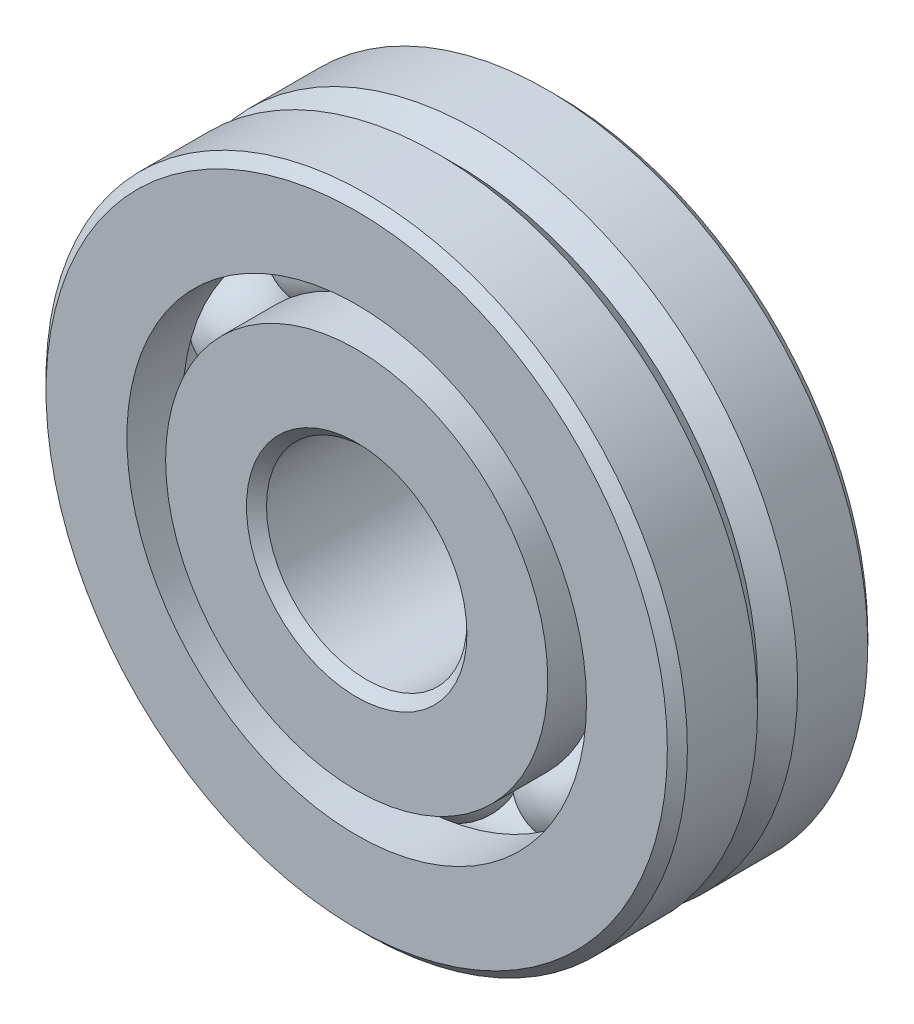
ISO-10303-21;
HEADER;
FILE_DESCRIPTION(('STEP AP214'),'2;1');
FILE_NAME('part.step','',(''),(''),'','','');
FILE_SCHEMA(('AUTOMOTIVE_DESIGN { 1 0 10303 214 1 1 1 1 }'));
ENDSEC;
DATA;
#1=APPLICATION_CONTEXT('core data for automotive mechanical design processes');
#2=APPLICATION_PROTOCOL_DEFINITION('international standard','automotive_design',2000,#1);
#3=PRODUCT_CONTEXT('',#1,'mechanical');
#4=PRODUCT('Part','Part','',(#3));
#5=PRODUCT_RELATED_PRODUCT_CATEGORY('part','',(#4));
#6=PRODUCT_DEFINITION_FORMATION('','',#4);
#7=PRODUCT_DEFINITION_CONTEXT('part definition',#1,'design');
#8=PRODUCT_DEFINITION('design','',#6,#7);
#9=PRODUCT_DEFINITION_SHAPE('','',#8);
#10=(LENGTH_UNIT() NAMED_UNIT(*) SI_UNIT(.MILLI.,.METRE.));
#11=(NAMED_UNIT(*) PLANE_ANGLE_UNIT() SI_UNIT($,.RADIAN.));
#12=(NAMED_UNIT(*) SI_UNIT($,.STERADIAN.) SOLID_ANGLE_UNIT());
#13=UNCERTAINTY_MEASURE_WITH_UNIT(LENGTH_MEASURE(1.E-05),#10,'distance_accuracy_value','');
#14=(GEOMETRIC_REPRESENTATION_CONTEXT(3) GLOBAL_UNCERTAINTY_ASSIGNED_CONTEXT((#13)) GLOBAL_UNIT_ASSIGNED_CONTEXT((#10,
#11,#12)) REPRESENTATION_CONTEXT('',''));
#15=CARTESIAN_POINT('',(0.,0.,0.));
#16=DIRECTION('',(0.,0.,1.));
#17=DIRECTION('',(1.,0.,0.));
#18=AXIS2_PLACEMENT_3D('',#15,#16,#17);
#19=CARTESIAN_POINT('',(-3.08587257453543,4.24733922046851,0.));
#20=DIRECTION('',(0.,0.,1.));
#21=DIRECTION('',(-0.587785252292462,0.809016994374955,0.));
#22=AXIS2_PLACEMENT_3D('',#19,#20,#21);
#23=SPHERICAL_SURFACE('',#22,1.21175743903915);
#24=CARTESIAN_POINT('',(-3.08587257453543,4.24733922046851,1.21175743903915));
#25=VERTEX_POINT('',#24);
#26=VERTEX_LOOP('',#25);
#27=FACE_BOUND('',#26,.T.);
#28=ADVANCED_FACE('F38',(#27),#23,.T.);
#29=CLOSED_SHELL('',(#28));
#30=MANIFOLD_SOLID_BREP('B2',#29);
#31=CARTESIAN_POINT('',(-4.99304671054954,1.62233922046853,0.));
#32=DIRECTION('',(0.,0.,1.));
#33=DIRECTION('',(-0.95105651629515,0.309016994374958,0.));
#34=AXIS2_PLACEMENT_3D('',#31,#32,#33);
#35=SPHERICAL_SURFACE('',#34,1.21175743903915);
#36=CARTESIAN_POINT('',(-4.99304671054954,1.62233922046853,1.21175743903915));
#37=VERTEX_POINT('',#36);
#38=VERTEX_LOOP('',#37);
#39=FACE_BOUND('',#38,.T.);
#40=ADVANCED_FACE('F59',(#39),#35,.T.);
#41=CLOSED_SHELL('',(#40));
#42=MANIFOLD_SOLID_BREP('B6',#41);
#43=CARTESIAN_POINT('',(-4.99304671054957,-1.62233922046843,0.));
#44=DIRECTION('',(0.,0.,1.));
#45=DIRECTION('',(-0.951056516295157,-0.309016994374938,0.));
#46=AXIS2_PLACEMENT_3D('',#43,#44,#45);
#47=SPHERICAL_SURFACE('',#46,1.21175743903915);
#48=CARTESIAN_POINT('',(-4.99304671054957,-1.62233922046843,1.21175743903915));
#49=VERTEX_POINT('',#48);
#50=VERTEX_LOOP('',#49);
#51=FACE_BOUND('',#50,.T.);
#52=ADVANCED_FACE('F80',(#51),#47,.T.);
#53=CLOSED_SHELL('',(#52));
#54=MANIFOLD_SOLID_BREP('B34',#53);
#55=CARTESIAN_POINT('',(-3.08587257453552,-4.24733922046845,0.));
#56=DIRECTION('',(0.,0.,1.));
#57=DIRECTION('',(-0.58778525229248,-0.809016994374942,0.));
#58=AXIS2_PLACEMENT_3D('',#55,#56,#57);
#59=SPHERICAL_SURFACE('',#58,1.21175743903915);
#60=CARTESIAN_POINT('',(-3.08587257453552,-4.24733922046845,1.21175743903915));
#61=VERTEX_POINT('',#60);
#62=VERTEX_LOOP('',#61);
#63=FACE_BOUND('',#62,.T.);
#64=ADVANCED_FACE('F101',(#63),#59,.T.);
#65=CLOSED_SHELL('',(#64));
#66=MANIFOLD_SOLID_BREP('B55',#65);
#67=CARTESIAN_POINT('',(0.,-5.25,0.));
#68=DIRECTION('',(0.,0.,1.));
#69=DIRECTION('',(0.,-1.,0.));
#70=AXIS2_PLACEMENT_3D('',#67,#68,#69);
#71=SPHERICAL_SURFACE('',#70,1.21175743903915);
#72=CARTESIAN_POINT('',(0.,-5.25,1.21175743903915));
#73=VERTEX_POINT('',#72);
#74=VERTEX_LOOP('',#73);
#75=FACE_BOUND('',#74,.T.);
#76=ADVANCED_FACE('F122',(#75),#71,.T.);
#77=CLOSED_SHELL('',(#76));
#78=MANIFOLD_SOLID_BREP('B76',#77);
#79=CARTESIAN_POINT('',(3.08587257453546,-4.24733922046849,0.));
#80=DIRECTION('',(0.,0.,1.));
#81=DIRECTION('',(0.587785252292469,-0.809016994374951,0.));
#82=AXIS2_PLACEMENT_3D('',#79,#80,#81);
#83=SPHERICAL_SURFACE('',#82,1.21175743903915);
#84=CARTESIAN_POINT('',(3.08587257453546,-4.24733922046849,1.21175743903915));
#85=VERTEX_POINT('',#84);
#86=VERTEX_LOOP('',#85);
#87=FACE_BOUND('',#86,.T.);
#88=ADVANCED_FACE('F143',(#87),#83,.T.);
#89=CLOSED_SHELL('',(#88));
#90=MANIFOLD_SOLID_BREP('B97',#89);
#91=CARTESIAN_POINT('',(4.99304671054955,-1.6223392204685,0.));
#92=DIRECTION('',(0.,0.,1.));
#93=DIRECTION('',(0.951056516295152,-0.309016994374952,0.));
#94=AXIS2_PLACEMENT_3D('',#91,#92,#93);
#95=SPHERICAL_SURFACE('',#94,1.21175743903915);
#96=CARTESIAN_POINT('',(4.99304671054955,-1.6223392204685,1.21175743903915));
#97=VERTEX_POINT('',#96);
#98=VERTEX_LOOP('',#97);
#99=FACE_BOUND('',#98,.T.);
#100=ADVANCED_FACE('F164',(#99),#95,.T.);
#101=CLOSED_SHELL('',(#100));
#102=MANIFOLD_SOLID_BREP('B118',#101);
#103=CARTESIAN_POINT('',(4.99304671054956,1.62233922046846,0.));
#104=DIRECTION('',(0.,0.,1.));
#105=DIRECTION('',(0.951056516295155,0.309016994374945,0.));
#106=AXIS2_PLACEMENT_3D('',#103,#104,#105);
#107=SPHERICAL_SURFACE('',#106,1.21175743903915);
#108=CARTESIAN_POINT('',(4.99304671054956,1.62233922046846,1.21175743903915));
#109=VERTEX_POINT('',#108);
#110=VERTEX_LOOP('',#109);
#111=FACE_BOUND('',#110,.T.);
#112=ADVANCED_FACE('F185',(#111),#107,.T.);
#113=CLOSED_SHELL('',(#112));
#114=MANIFOLD_SOLID_BREP('B139',#113);
#115=CARTESIAN_POINT('',(3.08587257453549,4.24733922046847,0.));
#116=DIRECTION('',(0.,0.,1.));
#117=DIRECTION('',(0.587785252292474,0.809016994374947,0.));
#118=AXIS2_PLACEMENT_3D('',#115,#116,#117);
#119=SPHERICAL_SURFACE('',#118,1.21175743903915);
#120=CARTESIAN_POINT('',(3.08587257453549,4.24733922046847,1.21175743903915));
#121=VERTEX_POINT('',#120);
#122=VERTEX_LOOP('',#121);
#123=FACE_BOUND('',#122,.T.);
#124=ADVANCED_FACE('F206',(#123),#119,.T.);
#125=CLOSED_SHELL('',(#124));
#126=MANIFOLD_SOLID_BREP('B160',#125);
#127=CARTESIAN_POINT('',(0.,5.25,0.));
#128=DIRECTION('',(0.,0.,1.));
#129=DIRECTION('',(0.,1.,0.));
#130=AXIS2_PLACEMENT_3D('',#127,#128,#129);
#131=SPHERICAL_SURFACE('',#130,1.21175743903915);
#132=CARTESIAN_POINT('',(0.,5.25,1.21175743903915));
#133=VERTEX_POINT('',#132);
#134=VERTEX_LOOP('',#133);
#135=FACE_BOUND('',#134,.T.);
#136=ADVANCED_FACE('F229',(#135),#131,.T.);
#137=CLOSED_SHELL('',(#136));
#138=MANIFOLD_SOLID_BREP('B181',#137);
#139=CARTESIAN_POINT('',(0.,4.76648351648352,2.5));
#140=DIRECTION('',(0.,0.,-1.));
#141=DIRECTION('',(-1.,0.,0.));
#142=AXIS2_PLACEMENT_3D('',#139,#140,#141);
#143=PLANE('',#142);
#144=CARTESIAN_POINT('',(0.,0.,2.5));
#145=DIRECTION('',(0.,0.,1.));
#146=DIRECTION('',(1.,0.,0.));
#147=AXIS2_PLACEMENT_3D('',#144,#145,#146);
#148=CIRCLE('',#147,2.75);
#149=CARTESIAN_POINT('',(2.75,0.,2.5));
#150=VERTEX_POINT('',#149);
#151=EDGE_CURVE('E277',#150,#150,#148,.T.);
#152=ORIENTED_EDGE('',*,*,#151,.F.);
#153=EDGE_LOOP('',(#152));
#154=FACE_BOUND('',#153,.T.);
#155=CARTESIAN_POINT('',(0.,0.,2.5));
#156=DIRECTION('',(0.,0.,1.));
#157=DIRECTION('',(1.,0.,0.));
#158=AXIS2_PLACEMENT_3D('',#155,#156,#157);
#159=CIRCLE('',#158,4.76648351648352);
#160=CARTESIAN_POINT('',(4.76648351648352,0.,2.5));
#161=VERTEX_POINT('',#160);
#162=EDGE_CURVE('E228',#161,#161,#159,.T.);
#163=ORIENTED_EDGE('',*,*,#162,.T.);
#164=EDGE_LOOP('',(#163));
#165=FACE_BOUND('',#164,.T.);
#166=ADVANCED_FACE('F249',(#154,#165),#143,.F.);
#167=CARTESIAN_POINT('',(0.,0.,2.5));
#168=DIRECTION('',(0.,0.,1.));
#169=DIRECTION('',(1.,0.,0.));
#170=AXIS2_PLACEMENT_3D('',#167,#168,#169);
#171=CYLINDRICAL_SURFACE('',#170,4.76648351648352);
#172=ORIENTED_EDGE('',*,*,#162,.F.);
#173=EDGE_LOOP('',(#172));
#174=FACE_BOUND('',#173,.T.);
#175=CARTESIAN_POINT('',(0.,0.,1.11111111111111));
#176=DIRECTION('',(0.,0.,1.));
#177=DIRECTION('',(1.,0.,0.));
#178=AXIS2_PLACEMENT_3D('',#175,#176,#177);
#179=CIRCLE('',#178,4.76648351648352);
#180=CARTESIAN_POINT('',(4.76648351648352,0.,1.11111111111111));
#181=VERTEX_POINT('',#180);
#182=EDGE_CURVE('E255',#181,#181,#179,.T.);
#183=ORIENTED_EDGE('',*,*,#182,.T.);
#184=EDGE_LOOP('',(#183));
#185=FACE_BOUND('',#184,.T.);
#186=ADVANCED_FACE('F284',(#174,#185),#171,.T.);
#187=CARTESIAN_POINT('',(0.,0.,0.));
#188=DIRECTION('',(0.,0.,1.));
#189=DIRECTION('',(1.,0.,0.));
#190=AXIS2_PLACEMENT_3D('',#187,#188,#189);
#191=TOROIDAL_SURFACE('',#190,5.25,1.21175743903915);
#192=ORIENTED_EDGE('',*,*,#182,.F.);
#193=EDGE_LOOP('',(#192));
#194=FACE_BOUND('',#193,.T.);
#195=CARTESIAN_POINT('',(0.,0.,-1.11111111111111));
#196=DIRECTION('',(0.,0.,1.));
#197=DIRECTION('',(1.,0.,0.));
#198=AXIS2_PLACEMENT_3D('',#195,#196,#197);
#199=CIRCLE('',#198,4.76648351648352);
#200=CARTESIAN_POINT('',(4.76648351648352,0.,-1.11111111111111));
#201=VERTEX_POINT('',#200);
#202=EDGE_CURVE('E259',#201,#201,#199,.T.);
#203=ORIENTED_EDGE('',*,*,#202,.T.);
#204=EDGE_LOOP('',(#203));
#205=FACE_BOUND('',#204,.T.);
#206=ADVANCED_FACE('F288',(#194,#205),#191,.F.);
#207=CARTESIAN_POINT('',(0.,0.,2.5));
#208=DIRECTION('',(0.,0.,1.));
#209=DIRECTION('',(1.,0.,0.));
#210=AXIS2_PLACEMENT_3D('',#207,#208,#209);
#211=CYLINDRICAL_SURFACE('',#210,4.76648351648352);
#212=ORIENTED_EDGE('',*,*,#202,.F.);
#213=EDGE_LOOP('',(#212));
#214=FACE_BOUND('',#213,.T.);
#215=CARTESIAN_POINT('',(0.,0.,-2.5));
#216=DIRECTION('',(0.,0.,1.));
#217=DIRECTION('',(1.,0.,0.));
#218=AXIS2_PLACEMENT_3D('',#215,#216,#217);
#219=CIRCLE('',#218,4.76648351648352);
#220=CARTESIAN_POINT('',(4.76648351648352,0.,-2.5));
#221=VERTEX_POINT('',#220);
#222=EDGE_CURVE('E263',#221,#221,#219,.T.);
#223=ORIENTED_EDGE('',*,*,#222,.T.);
#224=EDGE_LOOP('',(#223));
#225=FACE_BOUND('',#224,.T.);
#226=ADVANCED_FACE('F293',(#214,#225),#211,.T.);
#227=CARTESIAN_POINT('',(0.,2.75,-2.5));
#228=DIRECTION('',(0.,0.,1.));
#229=DIRECTION('',(1.,0.,0.));
#230=AXIS2_PLACEMENT_3D('',#227,#228,#229);
#231=PLANE('',#230);
#232=ORIENTED_EDGE('',*,*,#222,.F.);
#233=EDGE_LOOP('',(#232));
#234=FACE_BOUND('',#233,.T.);
#235=CARTESIAN_POINT('',(0.,0.,-2.5));
#236=DIRECTION('',(0.,0.,1.));
#237=DIRECTION('',(1.,0.,0.));
#238=AXIS2_PLACEMENT_3D('',#235,#236,#237);
#239=CIRCLE('',#238,2.75);
#240=CARTESIAN_POINT('',(2.75,0.,-2.5));
#241=VERTEX_POINT('',#240);
#242=EDGE_CURVE('E268',#241,#241,#239,.T.);
#243=ORIENTED_EDGE('',*,*,#242,.T.);
#244=EDGE_LOOP('',(#243));
#245=FACE_BOUND('',#244,.T.);
#246=ADVANCED_FACE('F299',(#234,#245),#231,.F.);
#247=CARTESIAN_POINT('',(0.,0.,-2.25));
#248=DIRECTION('',(0.,0.,-1.));
#249=DIRECTION('',(-1.,0.,0.));
#250=AXIS2_PLACEMENT_3D('',#247,#248,#249);
#251=CONICAL_SURFACE('',#250,2.5,0.785398163397444);
#252=ORIENTED_EDGE('',*,*,#242,.F.);
#253=EDGE_LOOP('',(#252));
#254=FACE_BOUND('',#253,.T.);
#255=CARTESIAN_POINT('',(0.,0.,-2.25));
#256=DIRECTION('',(0.,0.,1.));
#257=DIRECTION('',(1.,0.,0.));
#258=AXIS2_PLACEMENT_3D('',#255,#256,#257);
#259=CIRCLE('',#258,2.5);
#260=CARTESIAN_POINT('',(2.5,0.,-2.25));
#261=VERTEX_POINT('',#260);
#262=EDGE_CURVE('E271',#261,#261,#259,.T.);
#263=ORIENTED_EDGE('',*,*,#262,.T.);
#264=EDGE_LOOP('',(#263));
#265=FACE_BOUND('',#264,.T.);
#266=ADVANCED_FACE('F303',(#254,#265),#251,.F.);
#267=CARTESIAN_POINT('',(0.,0.,2.5));
#268=DIRECTION('',(0.,0.,1.));
#269=DIRECTION('',(1.,0.,0.));
#270=AXIS2_PLACEMENT_3D('',#267,#268,#269);
#271=CYLINDRICAL_SURFACE('',#270,2.5);
#272=ORIENTED_EDGE('',*,*,#262,.F.);
#273=EDGE_LOOP('',(#272));
#274=FACE_BOUND('',#273,.T.);
#275=CARTESIAN_POINT('',(0.,0.,2.25));
#276=DIRECTION('',(0.,0.,1.));
#277=DIRECTION('',(1.,0.,0.));
#278=AXIS2_PLACEMENT_3D('',#275,#276,#277);
#279=CIRCLE('',#278,2.5);
#280=CARTESIAN_POINT('',(2.5,0.,2.25));
#281=VERTEX_POINT('',#280);
#282=EDGE_CURVE('E274',#281,#281,#279,.T.);
#283=ORIENTED_EDGE('',*,*,#282,.T.);
#284=EDGE_LOOP('',(#283));
#285=FACE_BOUND('',#284,.T.);
#286=ADVANCED_FACE('F307',(#274,#285),#271,.F.);
#287=CARTESIAN_POINT('',(0.,0.,2.5));
#288=DIRECTION('',(0.,0.,1.));
#289=DIRECTION('',(1.,0.,0.));
#290=AXIS2_PLACEMENT_3D('',#287,#288,#289);
#291=CONICAL_SURFACE('',#290,2.75,0.785398163397453);
#292=ORIENTED_EDGE('',*,*,#282,.F.);
#293=EDGE_LOOP('',(#292));
#294=FACE_BOUND('',#293,.T.);
#295=ORIENTED_EDGE('',*,*,#151,.T.);
#296=EDGE_LOOP('',(#295));
#297=FACE_BOUND('',#296,.T.);
#298=ADVANCED_FACE('F281',(#294,#297),#291,.F.);
#299=CLOSED_SHELL('',(#166,#186,#206,#226,#246,#266,#286,#298));
#300=MANIFOLD_SOLID_BREP('B202',#299);
#301=CARTESIAN_POINT('',(0.,0.,2.5));
#302=DIRECTION('',(0.,0.,1.));
#303=DIRECTION('',(1.,0.,0.));
#304=AXIS2_PLACEMENT_3D('',#301,#302,#303);
#305=CYLINDRICAL_SURFACE('',#304,8.);
#306=CARTESIAN_POINT('',(0.,0.,2.25));
#307=DIRECTION('',(0.,0.,1.));
#308=DIRECTION('',(1.,0.,0.));
#309=AXIS2_PLACEMENT_3D('',#306,#307,#308);
#310=CIRCLE('',#309,8.);
#311=CARTESIAN_POINT('',(8.,0.,2.25));
#312=VERTEX_POINT('',#311);
#313=EDGE_CURVE('E408',#312,#312,#310,.T.);
#314=ORIENTED_EDGE('',*,*,#313,.F.);
#315=EDGE_LOOP('',(#314));
#316=FACE_BOUND('',#315,.T.);
#317=CARTESIAN_POINT('',(0.,0.,0.499999999999998));
#318=DIRECTION('',(0.,0.,1.));
#319=DIRECTION('',(1.,0.,0.));
#320=AXIS2_PLACEMENT_3D('',#317,#318,#319);
#321=CIRCLE('',#320,8.);
#322=CARTESIAN_POINT('',(8.,0.,0.499999999999998));
#323=VERTEX_POINT('',#322);
#324=EDGE_CURVE('E248',#323,#323,#321,.T.);
#325=ORIENTED_EDGE('',*,*,#324,.T.);
#326=EDGE_LOOP('',(#325));
#327=FACE_BOUND('',#326,.T.);
#328=ADVANCED_FACE('F371',(#316,#327),#305,.T.);
#329=CARTESIAN_POINT('',(0.,0.,0.));
#330=DIRECTION('',(0.,0.,1.));
#331=DIRECTION('',(1.,0.,0.));
#332=AXIS2_PLACEMENT_3D('',#329,#330,#331);
#333=CONICAL_SURFACE('',#332,7.5,0.78539816339745);
#334=ORIENTED_EDGE('',*,*,#324,.F.);
#335=EDGE_LOOP('',(#334));
#336=FACE_BOUND('',#335,.T.);
#337=CARTESIAN_POINT('',(0.,0.,0.));
#338=DIRECTION('',(0.,0.,1.));
#339=DIRECTION('',(1.,0.,0.));
#340=AXIS2_PLACEMENT_3D('',#337,#338,#339);
#341=CIRCLE('',#340,7.5);
#342=CARTESIAN_POINT('',(7.5,0.,0.));
#343=VERTEX_POINT('',#342);
#344=EDGE_CURVE('E377',#343,#343,#341,.T.);
#345=ORIENTED_EDGE('',*,*,#344,.T.);
#346=EDGE_LOOP('',(#345));
#347=FACE_BOUND('',#346,.T.);
#348=ADVANCED_FACE('F415',(#336,#347),#333,.T.);
#349=CARTESIAN_POINT('',(0.,0.,-0.500000000000002));
#350=DIRECTION('',(0.,0.,-1.));
#351=DIRECTION('',(-1.,0.,0.));
#352=AXIS2_PLACEMENT_3D('',#349,#350,#351);
#353=CONICAL_SURFACE('',#352,8.,0.785398163397447);
#354=ORIENTED_EDGE('',*,*,#344,.F.);
#355=EDGE_LOOP('',(#354));
#356=FACE_BOUND('',#355,.T.);
#357=CARTESIAN_POINT('',(0.,0.,-0.500000000000002));
#358=DIRECTION('',(0.,0.,1.));
#359=DIRECTION('',(1.,0.,0.));
#360=AXIS2_PLACEMENT_3D('',#357,#358,#359);
#361=CIRCLE('',#360,8.);
#362=CARTESIAN_POINT('',(8.,0.,-0.500000000000002));
#363=VERTEX_POINT('',#362);
#364=EDGE_CURVE('E381',#363,#363,#361,.T.);
#365=ORIENTED_EDGE('',*,*,#364,.T.);
#366=EDGE_LOOP('',(#365));
#367=FACE_BOUND('',#366,.T.);
#368=ADVANCED_FACE('F419',(#356,#367),#353,.T.);
#369=CARTESIAN_POINT('',(0.,0.,2.5));
#370=DIRECTION('',(0.,0.,1.));
#371=DIRECTION('',(1.,0.,0.));
#372=AXIS2_PLACEMENT_3D('',#369,#370,#371);
#373=CYLINDRICAL_SURFACE('',#372,8.);
#374=ORIENTED_EDGE('',*,*,#364,.F.);
#375=EDGE_LOOP('',(#374));
#376=FACE_BOUND('',#375,.T.);
#377=CARTESIAN_POINT('',(0.,0.,-2.25));
#378=DIRECTION('',(0.,0.,1.));
#379=DIRECTION('',(1.,0.,0.));
#380=AXIS2_PLACEMENT_3D('',#377,#378,#379);
#381=CIRCLE('',#380,8.);
#382=CARTESIAN_POINT('',(8.,0.,-2.25));
#383=VERTEX_POINT('',#382);
#384=EDGE_CURVE('E385',#383,#383,#381,.T.);
#385=ORIENTED_EDGE('',*,*,#384,.T.);
#386=EDGE_LOOP('',(#385));
#387=FACE_BOUND('',#386,.T.);
#388=ADVANCED_FACE('F424',(#376,#387),#373,.T.);
#389=CARTESIAN_POINT('',(0.,0.,-2.5));
#390=DIRECTION('',(0.,0.,1.));
#391=DIRECTION('',(1.,0.,0.));
#392=AXIS2_PLACEMENT_3D('',#389,#390,#391);
#393=CONICAL_SURFACE('',#392,7.75,0.785398163397443);
#394=ORIENTED_EDGE('',*,*,#384,.F.);
#395=EDGE_LOOP('',(#394));
#396=FACE_BOUND('',#395,.T.);
#397=CARTESIAN_POINT('',(0.,0.,-2.5));
#398=DIRECTION('',(0.,0.,1.));
#399=DIRECTION('',(1.,0.,0.));
#400=AXIS2_PLACEMENT_3D('',#397,#398,#399);
#401=CIRCLE('',#400,7.75);
#402=CARTESIAN_POINT('',(7.75,0.,-2.5));
#403=VERTEX_POINT('',#402);
#404=EDGE_CURVE('E390',#403,#403,#401,.T.);
#405=ORIENTED_EDGE('',*,*,#404,.T.);
#406=EDGE_LOOP('',(#405));
#407=FACE_BOUND('',#406,.T.);
#408=ADVANCED_FACE('F430',(#396,#407),#393,.T.);
#409=CARTESIAN_POINT('',(0.,7.75,-2.5));
#410=DIRECTION('',(0.,0.,1.));
#411=DIRECTION('',(1.,0.,0.));
#412=AXIS2_PLACEMENT_3D('',#409,#410,#411);
#413=PLANE('',#412);
#414=ORIENTED_EDGE('',*,*,#404,.F.);
#415=EDGE_LOOP('',(#414));
#416=FACE_BOUND('',#415,.T.);
#417=CARTESIAN_POINT('',(0.,0.,-2.5));
#418=DIRECTION('',(0.,0.,1.));
#419=DIRECTION('',(1.,0.,0.));
#420=AXIS2_PLACEMENT_3D('',#417,#418,#419);
#421=CIRCLE('',#420,5.73351648351648);
#422=CARTESIAN_POINT('',(5.73351648351648,0.,-2.5));
#423=VERTEX_POINT('',#422);
#424=EDGE_CURVE('E393',#423,#423,#421,.T.);
#425=ORIENTED_EDGE('',*,*,#424,.T.);
#426=EDGE_LOOP('',(#425));
#427=FACE_BOUND('',#426,.T.);
#428=ADVANCED_FACE('F434',(#416,#427),#413,.F.);
#429=CARTESIAN_POINT('',(0.,0.,2.5));
#430=DIRECTION('',(0.,0.,1.));
#431=DIRECTION('',(1.,0.,0.));
#432=AXIS2_PLACEMENT_3D('',#429,#430,#431);
#433=CYLINDRICAL_SURFACE('',#432,5.73351648351648);
#434=ORIENTED_EDGE('',*,*,#424,.F.);
#435=EDGE_LOOP('',(#434));
#436=FACE_BOUND('',#435,.T.);
#437=CARTESIAN_POINT('',(0.,0.,-1.11111111111111));
#438=DIRECTION('',(0.,0.,1.));
#439=DIRECTION('',(1.,0.,0.));
#440=AXIS2_PLACEMENT_3D('',#437,#438,#439);
#441=CIRCLE('',#440,5.73351648351648);
#442=CARTESIAN_POINT('',(5.73351648351648,0.,-1.11111111111111));
#443=VERTEX_POINT('',#442);
#444=EDGE_CURVE('E396',#443,#443,#441,.T.);
#445=ORIENTED_EDGE('',*,*,#444,.T.);
#446=EDGE_LOOP('',(#445));
#447=FACE_BOUND('',#446,.T.);
#448=ADVANCED_FACE('F438',(#436,#447),#433,.F.);
#449=CARTESIAN_POINT('',(0.,0.,0.));
#450=DIRECTION('',(0.,0.,1.));
#451=DIRECTION('',(1.,0.,0.));
#452=AXIS2_PLACEMENT_3D('',#449,#450,#451);
#453=TOROIDAL_SURFACE('',#452,5.25,1.21175743903915);
#454=ORIENTED_EDGE('',*,*,#444,.F.);
#455=EDGE_LOOP('',(#454));
#456=FACE_BOUND('',#455,.T.);
#457=CARTESIAN_POINT('',(0.,0.,1.11111111111111));
#458=DIRECTION('',(0.,0.,1.));
#459=DIRECTION('',(1.,0.,0.));
#460=AXIS2_PLACEMENT_3D('',#457,#458,#459);
#461=CIRCLE('',#460,5.73351648351648);
#462=CARTESIAN_POINT('',(5.73351648351648,0.,1.11111111111111));
#463=VERTEX_POINT('',#462);
#464=EDGE_CURVE('E399',#463,#463,#461,.T.);
#465=ORIENTED_EDGE('',*,*,#464,.T.);
#466=EDGE_LOOP('',(#465));
#467=FACE_BOUND('',#466,.T.);
#468=ADVANCED_FACE('F442',(#456,#467),#453,.F.);
#469=CARTESIAN_POINT('',(0.,0.,2.5));
#470=DIRECTION('',(0.,0.,1.));
#471=DIRECTION('',(1.,0.,0.));
#472=AXIS2_PLACEMENT_3D('',#469,#470,#471);
#473=CYLINDRICAL_SURFACE('',#472,5.73351648351648);
#474=ORIENTED_EDGE('',*,*,#464,.F.);
#475=EDGE_LOOP('',(#474));
#476=FACE_BOUND('',#475,.T.);
#477=CARTESIAN_POINT('',(0.,0.,2.5));
#478=DIRECTION('',(0.,0.,1.));
#479=DIRECTION('',(1.,0.,0.));
#480=AXIS2_PLACEMENT_3D('',#477,#478,#479);
#481=CIRCLE('',#480,5.73351648351648);
#482=CARTESIAN_POINT('',(5.73351648351648,0.,2.5));
#483=VERTEX_POINT('',#482);
#484=EDGE_CURVE('E402',#483,#483,#481,.T.);
#485=ORIENTED_EDGE('',*,*,#484,.T.);
#486=EDGE_LOOP('',(#485));
#487=FACE_BOUND('',#486,.T.);
#488=ADVANCED_FACE('F446',(#476,#487),#473,.F.);
#489=CARTESIAN_POINT('',(0.,7.75,2.5));
#490=DIRECTION('',(0.,0.,-1.));
#491=DIRECTION('',(-1.,0.,0.));
#492=AXIS2_PLACEMENT_3D('',#489,#490,#491);
#493=PLANE('',#492);
#494=ORIENTED_EDGE('',*,*,#484,.F.);
#495=EDGE_LOOP('',(#494));
#496=FACE_BOUND('',#495,.T.);
#497=CARTESIAN_POINT('',(0.,0.,2.5));
#498=DIRECTION('',(0.,0.,1.));
#499=DIRECTION('',(1.,0.,0.));
#500=AXIS2_PLACEMENT_3D('',#497,#498,#499);
#501=CIRCLE('',#500,7.75);
#502=CARTESIAN_POINT('',(7.75,0.,2.5));
#503=VERTEX_POINT('',#502);
#504=EDGE_CURVE('E405',#503,#503,#501,.T.);
#505=ORIENTED_EDGE('',*,*,#504,.T.);
#506=EDGE_LOOP('',(#505));
#507=FACE_BOUND('',#506,.T.);
#508=ADVANCED_FACE('F450',(#496,#507),#493,.F.);
#509=CARTESIAN_POINT('',(0.,0.,2.25));
#510=DIRECTION('',(0.,0.,-1.));
#511=DIRECTION('',(-1.,0.,0.));
#512=AXIS2_PLACEMENT_3D('',#509,#510,#511);
#513=CONICAL_SURFACE('',#512,8.,0.785398163397447);
#514=ORIENTED_EDGE('',*,*,#504,.F.);
#515=EDGE_LOOP('',(#514));
#516=FACE_BOUND('',#515,.T.);
#517=ORIENTED_EDGE('',*,*,#313,.T.);
#518=EDGE_LOOP('',(#517));
#519=FACE_BOUND('',#518,.T.);
#520=ADVANCED_FACE('F412',(#516,#519),#513,.T.);
#521=CLOSED_SHELL('',(#328,#348,#368,#388,#408,#428,#448,#468,#488,#508,#520));
#522=MANIFOLD_SOLID_BREP('B223',#521);
#523=ADVANCED_BREP_SHAPE_REPRESENTATION('',(#18,#30,#42,#54,#66,#78,#90,#102,#114,#126,#138,
#300,#522),#14);
#524=SHAPE_DEFINITION_REPRESENTATION(#9,#523);
ENDSEC;
END-ISO-10303-21;
